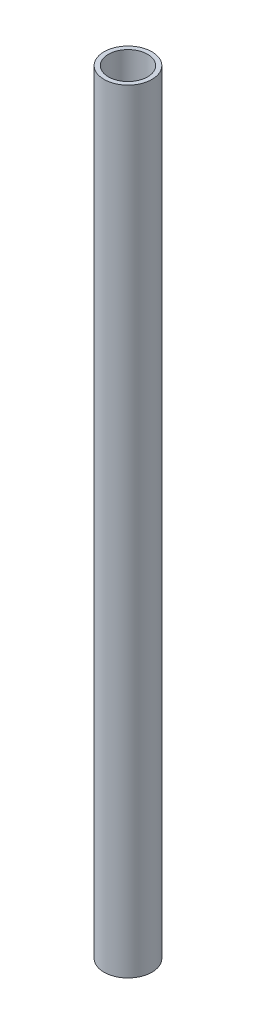
ISO-10303-21;
HEADER;
FILE_DESCRIPTION(('STEP AP214'),'2;1');
FILE_NAME('part.step','',(''),(''),'','','');
FILE_SCHEMA(('AUTOMOTIVE_DESIGN { 1 0 10303 214 1 1 1 1 }'));
ENDSEC;
DATA;
#1=APPLICATION_CONTEXT('core data for automotive mechanical design processes');
#2=APPLICATION_PROTOCOL_DEFINITION('international standard','automotive_design',2000,#1);
#3=PRODUCT_CONTEXT('',#1,'mechanical');
#4=PRODUCT('Part','Part','',(#3));
#5=PRODUCT_RELATED_PRODUCT_CATEGORY('part','',(#4));
#6=PRODUCT_DEFINITION_FORMATION('','',#4);
#7=PRODUCT_DEFINITION_CONTEXT('part definition',#1,'design');
#8=PRODUCT_DEFINITION('design','',#6,#7);
#9=PRODUCT_DEFINITION_SHAPE('','',#8);
#10=(LENGTH_UNIT() NAMED_UNIT(*) SI_UNIT(.MILLI.,.METRE.));
#11=(NAMED_UNIT(*) PLANE_ANGLE_UNIT() SI_UNIT($,.RADIAN.));
#12=(NAMED_UNIT(*) SI_UNIT($,.STERADIAN.) SOLID_ANGLE_UNIT());
#13=UNCERTAINTY_MEASURE_WITH_UNIT(LENGTH_MEASURE(1.E-05),#10,'distance_accuracy_value','');
#14=(GEOMETRIC_REPRESENTATION_CONTEXT(3) GLOBAL_UNCERTAINTY_ASSIGNED_CONTEXT((#13)) GLOBAL_UNIT_ASSIGNED_CONTEXT((#10,
#11,#12)) REPRESENTATION_CONTEXT('',''));
#15=CARTESIAN_POINT('',(0.,0.,0.));
#16=DIRECTION('',(0.,0.,1.));
#17=DIRECTION('',(1.,0.,0.));
#18=AXIS2_PLACEMENT_3D('',#15,#16,#17);
#19=CARTESIAN_POINT('',(0.,355.,0.));
#20=DIRECTION('',(0.,1.,0.));
#21=DIRECTION('',(0.,0.,1.));
#22=AXIS2_PLACEMENT_3D('',#19,#20,#21);
#23=PLANE('',#22);
#24=CARTESIAN_POINT('',(0.,355.,0.));
#25=DIRECTION('',(0.,1.,0.));
#26=DIRECTION('',(0.,0.,1.));
#27=AXIS2_PLACEMENT_3D('',#24,#25,#26);
#28=CIRCLE('',#27,11.);
#29=CARTESIAN_POINT('',(0.,355.,11.));
#30=VERTEX_POINT('',#29);
#31=EDGE_CURVE('E10',#30,#30,#28,.T.);
#32=ORIENTED_EDGE('',*,*,#31,.T.);
#33=EDGE_LOOP('',(#32));
#34=FACE_BOUND('',#33,.T.);
#35=CARTESIAN_POINT('',(0.,355.,0.));
#36=DIRECTION('',(0.,1.,0.));
#37=DIRECTION('',(0.,0.,1.));
#38=AXIS2_PLACEMENT_3D('',#35,#36,#37);
#39=CIRCLE('',#38,9.);
#40=CARTESIAN_POINT('',(0.,355.,9.));
#41=VERTEX_POINT('',#40);
#42=EDGE_CURVE('E41',#41,#41,#39,.T.);
#43=ORIENTED_EDGE('',*,*,#42,.F.);
#44=EDGE_LOOP('',(#43));
#45=FACE_BOUND('',#44,.T.);
#46=ADVANCED_FACE('F30',(#34,#45),#23,.T.);
#47=CARTESIAN_POINT('',(0.,0.,0.));
#48=DIRECTION('',(0.,1.,0.));
#49=DIRECTION('',(0.,0.,1.));
#50=AXIS2_PLACEMENT_3D('',#47,#48,#49);
#51=PLANE('',#50);
#52=CARTESIAN_POINT('',(0.,0.,0.));
#53=DIRECTION('',(0.,1.,0.));
#54=DIRECTION('',(0.,0.,1.));
#55=AXIS2_PLACEMENT_3D('',#52,#53,#54);
#56=CIRCLE('',#55,11.);
#57=CARTESIAN_POINT('',(0.,0.,11.));
#58=VERTEX_POINT('',#57);
#59=EDGE_CURVE('E34',#58,#58,#56,.T.);
#60=ORIENTED_EDGE('',*,*,#59,.F.);
#61=EDGE_LOOP('',(#60));
#62=FACE_BOUND('',#61,.T.);
#63=CARTESIAN_POINT('',(0.,0.,0.));
#64=DIRECTION('',(0.,1.,0.));
#65=DIRECTION('',(0.,0.,1.));
#66=AXIS2_PLACEMENT_3D('',#63,#64,#65);
#67=CIRCLE('',#66,9.);
#68=CARTESIAN_POINT('',(0.,0.,9.));
#69=VERTEX_POINT('',#68);
#70=EDGE_CURVE('E43',#69,#69,#67,.T.);
#71=ORIENTED_EDGE('',*,*,#70,.T.);
#72=EDGE_LOOP('',(#71));
#73=FACE_BOUND('',#72,.T.);
#74=ADVANCED_FACE('F53',(#62,#73),#51,.F.);
#75=CARTESIAN_POINT('',(0.,355.,0.));
#76=DIRECTION('',(0.,-1.,0.));
#77=DIRECTION('',(0.,0.,-1.));
#78=AXIS2_PLACEMENT_3D('',#75,#76,#77);
#79=CYLINDRICAL_SURFACE('',#78,11.);
#80=ORIENTED_EDGE('',*,*,#31,.F.);
#81=EDGE_LOOP('',(#80));
#82=FACE_BOUND('',#81,.T.);
#83=ORIENTED_EDGE('',*,*,#59,.T.);
#84=EDGE_LOOP('',(#83));
#85=FACE_BOUND('',#84,.T.);
#86=ADVANCED_FACE('F32',(#82,#85),#79,.T.);
#87=CARTESIAN_POINT('',(0.,355.,0.));
#88=DIRECTION('',(0.,-1.,0.));
#89=DIRECTION('',(0.,0.,-1.));
#90=AXIS2_PLACEMENT_3D('',#87,#88,#89);
#91=CYLINDRICAL_SURFACE('',#90,9.);
#92=ORIENTED_EDGE('',*,*,#42,.T.);
#93=EDGE_LOOP('',(#92));
#94=FACE_BOUND('',#93,.T.);
#95=ORIENTED_EDGE('',*,*,#70,.F.);
#96=EDGE_LOOP('',(#95));
#97=FACE_BOUND('',#96,.T.);
#98=ADVANCED_FACE('F49',(#94,#97),#91,.F.);
#99=CLOSED_SHELL('',(#46,#74,#86,#98));
#100=MANIFOLD_SOLID_BREP('B2',#99);
#101=ADVANCED_BREP_SHAPE_REPRESENTATION('',(#18,#100),#14);
#102=SHAPE_DEFINITION_REPRESENTATION(#9,#101);
ENDSEC;
END-ISO-10303-21;
